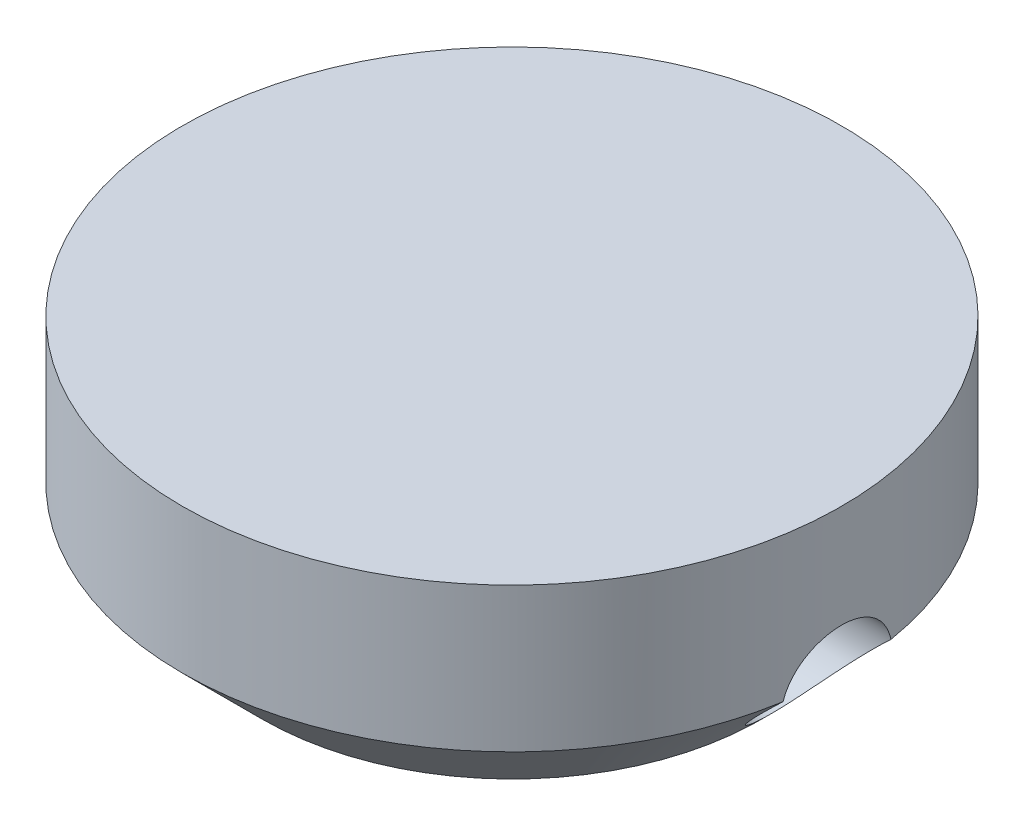
ISO-10303-21;
HEADER;
FILE_DESCRIPTION(('STEP AP214'),'2;1');
FILE_NAME('part.step','',(''),(''),'','','');
FILE_SCHEMA(('AUTOMOTIVE_DESIGN { 1 0 10303 214 1 1 1 1 }'));
ENDSEC;
DATA;
#1=APPLICATION_CONTEXT('core data for automotive mechanical design processes');
#2=APPLICATION_PROTOCOL_DEFINITION('international standard','automotive_design',2000,#1);
#3=PRODUCT_CONTEXT('',#1,'mechanical');
#4=PRODUCT('Part','Part','',(#3));
#5=PRODUCT_RELATED_PRODUCT_CATEGORY('part','',(#4));
#6=PRODUCT_DEFINITION_FORMATION('','',#4);
#7=PRODUCT_DEFINITION_CONTEXT('part definition',#1,'design');
#8=PRODUCT_DEFINITION('design','',#6,#7);
#9=PRODUCT_DEFINITION_SHAPE('','',#8);
#10=(LENGTH_UNIT() NAMED_UNIT(*) SI_UNIT(.MILLI.,.METRE.));
#11=(NAMED_UNIT(*) PLANE_ANGLE_UNIT() SI_UNIT($,.RADIAN.));
#12=(NAMED_UNIT(*) SI_UNIT($,.STERADIAN.) SOLID_ANGLE_UNIT());
#13=UNCERTAINTY_MEASURE_WITH_UNIT(LENGTH_MEASURE(1.E-05),#10,'distance_accuracy_value','');
#14=(GEOMETRIC_REPRESENTATION_CONTEXT(3) GLOBAL_UNCERTAINTY_ASSIGNED_CONTEXT((#13)) GLOBAL_UNIT_ASSIGNED_CONTEXT((#10,
#11,#12)) REPRESENTATION_CONTEXT('',''));
#15=CARTESIAN_POINT('',(0.,0.,0.));
#16=DIRECTION('',(0.,0.,1.));
#17=DIRECTION('',(1.,0.,0.));
#18=AXIS2_PLACEMENT_3D('',#15,#16,#17);
#19=CARTESIAN_POINT('',(0.,2.05188991842177,0.));
#20=DIRECTION('',(0.,1.,0.));
#21=DIRECTION('',(0.,0.,1.));
#22=AXIS2_PLACEMENT_3D('',#19,#20,#21);
#23=CYLINDRICAL_SURFACE('',#22,11.5);
#24=CARTESIAN_POINT('',(0.,3.36320645562729,0.));
#25=DIRECTION('',(0.,1.,0.));
#26=DIRECTION('',(0.,0.,1.));
#27=AXIS2_PLACEMENT_3D('',#24,#25,#26);
#28=CIRCLE('',#27,11.5);
#29=CARTESIAN_POINT('',(0.,3.36320645562729,11.5));
#30=VERTEX_POINT('',#29);
#31=EDGE_CURVE('E75',#30,#30,#28,.T.);
#32=ORIENTED_EDGE('',*,*,#31,.F.);
#33=EDGE_LOOP('',(#32));
#34=FACE_BOUND('',#33,.T.);
#35=CARTESIAN_POINT('',(0.,-1.67679354437271,0.));
#36=DIRECTION('',(0.,1.,0.));
#37=DIRECTION('',(0.,0.,1.));
#38=AXIS2_PLACEMENT_3D('',#35,#36,#37);
#39=CIRCLE('',#38,11.5);
#40=CARTESIAN_POINT('',(11.3444920556189,-1.67679354437274,-1.88480768249708));
#41=VERTEX_POINT('',#40);
#42=CARTESIAN_POINT('',(11.3444920556189,-1.67679354437271,1.88480768249708));
#43=VERTEX_POINT('',#42);
#44=EDGE_CURVE('E69',#41,#43,#39,.T.);
#45=ORIENTED_EDGE('',*,*,#44,.T.);
#46=CARTESIAN_POINT('',(11.3444920556189,-1.67679354437271,1.88480768249708));
#47=CARTESIAN_POINT('',(11.3468284221465,-1.62373960870673,1.87073340398523));
#48=CARTESIAN_POINT('',(11.3495124692565,-1.5713212912191,1.85442897940498));
#49=CARTESIAN_POINT('',(11.3554888369818,-1.46807999935229,1.81748001827356));
#50=CARTESIAN_POINT('',(11.3587810842125,-1.41725683336869,1.79683600529039));
#51=CARTESIAN_POINT('',(11.369427200217,-1.26783393344676,1.72865414954118));
#52=CARTESIAN_POINT('',(11.3775598493998,-1.17207968003871,1.67481284980909));
#53=CARTESIAN_POINT('',(11.394969652247,-0.991050854982532,1.55193475293948));
#54=CARTESIAN_POINT('',(11.4042469771064,-0.905777854702248,1.48289568164511));
#55=CARTESIAN_POINT('',(11.4229088745443,-0.747986225952632,1.33152357028815));
#56=CARTESIAN_POINT('',(11.4322934421887,-0.675467013170763,1.24919113959015));
#57=CARTESIAN_POINT('',(11.4501818370098,-0.544803105118978,1.07294693077831));
#58=CARTESIAN_POINT('',(11.4586799953876,-0.486747981292273,0.978968145029035));
#59=CARTESIAN_POINT('',(11.4737744859062,-0.387260320069406,0.782432281382731));
#60=CARTESIAN_POINT('',(11.4803706968045,-0.34582884230617,0.679874657152389));
#61=CARTESIAN_POINT('',(11.490876220563,-0.281072736992318,0.469827774989286));
#62=CARTESIAN_POINT('',(11.4948035571704,-0.257626507892004,0.362376935402624));
#63=CARTESIAN_POINT('',(11.4995992722202,-0.229106371226727,0.145007063385061));
#64=CARTESIAN_POINT('',(11.5004680921127,-0.22402981227744,0.0350883894533713));
#65=CARTESIAN_POINT('',(11.4990582011378,-0.232351895186461,-0.182709130590948));
#66=CARTESIAN_POINT('',(11.496816852495,-0.245531227049841,-0.290596679598678));
#67=CARTESIAN_POINT('',(11.489501556092,-0.289570038848792,-0.502603182224953));
#68=CARTESIAN_POINT('',(11.4844274548377,-0.320430476847251,-0.606721931303426));
#69=CARTESIAN_POINT('',(11.4719962073517,-0.398959680229114,-0.808415053102451));
#70=CARTESIAN_POINT('',(11.4646361588581,-0.446649823323022,-0.905980913600194));
#71=CARTESIAN_POINT('',(11.448437806743,-0.557465881502749,-1.09177819311709));
#72=CARTESIAN_POINT('',(11.4395994067786,-0.62059280271439,-1.18000900316665));
#73=CARTESIAN_POINT('',(11.4212881723889,-0.761432176749906,-1.34582166303546));
#74=CARTESIAN_POINT('',(11.4118087076437,-0.839319638095297,-1.42325408597318));
#75=CARTESIAN_POINT('',(11.3933744643323,-1.00700210476513,-1.56398887178821));
#76=CARTESIAN_POINT('',(11.3844195403974,-1.0967937882849,-1.62729516330683));
#77=CARTESIAN_POINT('',(11.3696678934275,-1.26710675148761,-1.72704748125247));
#78=CARTESIAN_POINT('',(11.3635966798849,-1.34595953597433,-1.76632885310879));
#79=CARTESIAN_POINT('',(11.3528749560394,-1.50826653134983,-1.83393731716198));
#80=CARTESIAN_POINT('',(11.3482236691574,-1.59171819745149,-1.86227039940366));
#81=CARTESIAN_POINT('',(11.3444920556189,-1.67679354437271,-1.88480768249708));
#82=B_SPLINE_CURVE_WITH_KNOTS('',3,(#46,#47,#48,#49,#50,#51,#52,#53,#54,#55,#56,#57,#58,#59,#60,
#61,#62,#63,#64,#65,#66,#67,#68,#69,#70,#71,#72,#73,#74,#75,#76,#77,#78,#79,#80,#81),
.UNSPECIFIED.,.F.,.F.,(4,2,2,2,2,2,2,2,2,2,2,2,2,2,2,2,2,4),(0.,0.164711990254142,
0.329404119527412,0.658171335010925,0.986987779887434,1.3157891561695,1.64657872933448,
1.9773893845087,2.30594315839199,2.63444950861043,2.95904351906084,3.28365511952444,
3.60868054662476,3.93372716361809,4.26290072119643,4.59198261736534,4.85610900275319,
5.12009067360874),.UNSPECIFIED.);
#83=EDGE_CURVE('E64',#43,#41,#82,.T.);
#84=ORIENTED_EDGE('',*,*,#83,.T.);
#85=EDGE_LOOP('',(#45,#84));
#86=FACE_BOUND('',#85,.T.);
#87=ADVANCED_FACE('F45',(#34,#86),#23,.T.);
#88=CARTESIAN_POINT('',(0.,-10.7267935443729,0.));
#89=DIRECTION('',(0.,1.,0.));
#90=DIRECTION('',(0.,0.,1.));
#91=AXIS2_PLACEMENT_3D('',#88,#89,#90);
#92=CONICAL_SURFACE('',#91,2.45,0.785398163397443);
#93=CARTESIAN_POINT('',(0.,-4.47679354437271,0.));
#94=DIRECTION('',(0.,-1.,0.));
#95=DIRECTION('',(0.,0.,-1.));
#96=AXIS2_PLACEMENT_3D('',#93,#94,#95);
#97=CIRCLE('',#96,8.70000000000009);
#98=CARTESIAN_POINT('',(0.,-4.47679354437271,-8.70000000000009));
#99=VERTEX_POINT('',#98);
#100=EDGE_CURVE('E59',#99,#99,#97,.T.);
#101=ORIENTED_EDGE('',*,*,#100,.F.);
#102=EDGE_LOOP('',(#101));
#103=FACE_BOUND('',#102,.T.);
#104=CARTESIAN_POINT('',(11.6061426012264,-1.43159354437271,1.80199249720969));
#105=CARTESIAN_POINT('',(11.5279158580471,-1.50428039621524,1.8320128172309));
#106=CARTESIAN_POINT('',(11.4490291959652,-1.57811809212512,1.85743787112628));
#107=CARTESIAN_POINT('',(11.2905611477516,-1.7276690109097,1.89917166663108));
#108=CARTESIAN_POINT('',(11.2109795054486,-1.80338294605263,1.91547688899015));
#109=CARTESIAN_POINT('',(11.0511880556809,-1.9567985849643,1.9391138869357));
#110=CARTESIAN_POINT('',(10.970978183577,-2.03451117806162,1.94637477854676));
#111=CARTESIAN_POINT('',(10.8112214228991,-2.19086357297871,1.95151716412626));
#112=CARTESIAN_POINT('',(10.7316743872075,-2.26950315916003,1.94940079811972));
#113=CARTESIAN_POINT('',(10.5237519186281,-2.47734971634499,1.93104833698264));
#114=CARTESIAN_POINT('',(10.3964089306532,-2.60699236136925,1.90670767190043));
#115=CARTESIAN_POINT('',(10.1488978086018,-2.86429666922943,1.82970004591626));
#116=CARTESIAN_POINT('',(10.0287093626456,-2.99196309571867,1.77711798726156));
#117=CARTESIAN_POINT('',(9.83117172657375,-3.2066753960387,1.65905664886782));
#118=CARTESIAN_POINT('',(9.75109038678959,-3.29528888329795,1.60102712819693));
#119=CARTESIAN_POINT('',(9.59945154066565,-3.46604957709664,1.4669907057576));
#120=CARTESIAN_POINT('',(9.52788270771035,-3.54820532567329,1.39100810366592));
#121=CARTESIAN_POINT('',(9.40935830809989,-3.68659566943572,1.23751432450478));
#122=CARTESIAN_POINT('',(9.36033999876943,-3.7447332021852,1.16332530723045));
#123=CARTESIAN_POINT('',(9.2713941062793,-3.85155036787317,1.00345099407743));
#124=CARTESIAN_POINT('',(9.23146387436412,-3.90023275594216,0.917769059455037));
#125=CARTESIAN_POINT('',(9.16218485644873,-3.98554628236984,0.735597372445281));
#126=CARTESIAN_POINT('',(9.13292596267207,-4.02207482451564,0.639024389645204));
#127=CARTESIAN_POINT('',(9.08705493499309,-4.07969511959211,0.438530872937108));
#128=CARTESIAN_POINT('',(9.07043141843112,-4.10080076567305,0.334617044547301));
#129=CARTESIAN_POINT('',(9.05214915662021,-4.12404404823324,0.138221249281872));
#130=CARTESIAN_POINT('',(9.04873022338802,-4.12841206152733,0.046160114219645));
#131=CARTESIAN_POINT('',(9.05210816850929,-4.1241064284966,-0.137450509603872));
#132=CARTESIAN_POINT('',(9.05890132744912,-4.11543753043103,-0.229000172463763));
#133=CARTESIAN_POINT('',(9.08170875918852,-4.08651558441075,-0.403538208434048));
#134=CARTESIAN_POINT('',(9.09717206636639,-4.06695513788901,-0.486716502932497));
#135=CARTESIAN_POINT('',(9.13628573487328,-4.01789810702338,-0.648031430616375));
#136=CARTESIAN_POINT('',(9.15993656258656,-3.98840095665936,-0.726167776297294));
#137=CARTESIAN_POINT('',(9.21616819395382,-3.91900491251078,-0.880192841740748));
#138=CARTESIAN_POINT('',(9.24918320247788,-3.87860665486834,-0.955695922385864));
#139=CARTESIAN_POINT('',(9.32231184164452,-3.79024139528291,-1.09833542456922));
#140=CARTESIAN_POINT('',(9.36242956518588,-3.74227003111666,-1.16546698384659));
#141=CARTESIAN_POINT('',(9.4672150403547,-3.61863006303115,-1.31793214914329));
#142=CARTESIAN_POINT('',(9.53501755507991,-3.53992697536068,-1.3986642066298));
#143=CARTESIAN_POINT('',(9.67982141013002,-3.37505724533394,-1.5422956593836));
#144=CARTESIAN_POINT('',(9.75684116492089,-3.28887576007166,-1.60515848043064));
#145=CARTESIAN_POINT('',(9.94539006218343,-3.08170043460063,-1.73296193245325));
#146=CARTESIAN_POINT('',(10.0596338993965,-2.95898550228085,-1.79108465979574));
#147=CARTESIAN_POINT('',(10.2956046481597,-2.71096237577228,-1.88004519073733));
#148=CARTESIAN_POINT('',(10.4173424639715,-2.58565058753249,-1.91084217957078));
#149=CARTESIAN_POINT('',(10.6681707495931,-2.3322075046328,-1.94812262070165));
#150=CARTESIAN_POINT('',(10.7973706812645,-2.20408995635013,-1.9539370053227));
#151=CARTESIAN_POINT('',(11.0570074781364,-1.95075066789551,-1.94099558597683));
#152=CARTESIAN_POINT('',(11.1874420224536,-1.82552460580043,-1.92227924354416));
#153=CARTESIAN_POINT('',(11.3656075845667,-1.65676817384387,-1.87997629337789));
#154=CARTESIAN_POINT('',(11.4140016280802,-1.61116493070446,-1.86677127655442));
#155=CARTESIAN_POINT('',(11.5103910299412,-1.52076558673305,-1.83695053168046));
#156=CARTESIAN_POINT('',(11.5583867519944,-1.47596869241121,-1.82033838140303));
#157=CARTESIAN_POINT('',(11.6061426012264,-1.43159354437271,-1.80199249720969));
#158=B_SPLINE_CURVE_WITH_KNOTS('',3,(#104,#105,#106,#107,#108,#109,#110,#111,#112,#113,#114,
#115,#116,#117,#118,#119,#120,#121,#122,#123,#124,#125,#126,#127,#128,#129,#130,#131,#132,#133,
#134,#135,#136,#137,#138,#139,#140,#141,#142,#143,#144,#145,#146,#147,#148,#149,#150,#151,#152,
#153,#154,#155,#156,#157),.UNSPECIFIED.,.F.,.F.,(4,2,2,2,2,2,2,2,2,2,2,2,2,2,2,2,2,2,2,2,2,2,2,
2,2,2,4),(0.,0.332630650640897,0.665389571669356,1.00074037302199,1.33601464644229,
1.88395095905799,2.43024915350797,2.82727760681341,3.22377172575004,3.54125143863902,
3.85863850200044,4.17864055074794,4.49835398083596,4.77358805101277,5.04872190065281,
5.30808254976316,5.56745797521983,5.84170269340373,6.116105960963,6.50861225722832,
6.90191623232042,7.43140911494124,7.9616915434317,8.50609045459935,9.04961468841831,
9.2529250263697,9.45602295471078),.UNSPECIFIED.);
#159=EDGE_CURVE('E11',#43,#41,#158,.T.);
#160=ORIENTED_EDGE('',*,*,#159,.F.);
#161=ORIENTED_EDGE('',*,*,#44,.F.);
#162=EDGE_LOOP('',(#160,#161));
#163=FACE_BOUND('',#162,.T.);
#164=ADVANCED_FACE('F47',(#103,#163),#92,.T.);
#165=CARTESIAN_POINT('',(0.,3.36320645562729,0.));
#166=DIRECTION('',(0.,1.,0.));
#167=DIRECTION('',(0.,0.,1.));
#168=AXIS2_PLACEMENT_3D('',#165,#166,#167);
#169=PLANE('',#168);
#170=ORIENTED_EDGE('',*,*,#31,.T.);
#171=EDGE_LOOP('',(#170));
#172=FACE_BOUND('',#171,.T.);
#173=ADVANCED_FACE('F103',(#172),#169,.T.);
#174=CARTESIAN_POINT('',(0.,-4.47679354437271,0.));
#175=DIRECTION('',(0.,-1.,0.));
#176=DIRECTION('',(0.,0.,-1.));
#177=AXIS2_PLACEMENT_3D('',#174,#175,#176);
#178=PLANE('',#177);
#179=ORIENTED_EDGE('',*,*,#100,.T.);
#180=EDGE_LOOP('',(#179));
#181=FACE_BOUND('',#180,.T.);
#182=ADVANCED_FACE('F100',(#181),#178,.T.);
#183=CARTESIAN_POINT('',(0.,5.42320645562729,0.));
#184=DIRECTION('',(0.,-1.,0.));
#185=DIRECTION('',(0.,0.,-1.));
#186=AXIS2_PLACEMENT_3D('',#183,#184,#185);
#187=CYLINDRICAL_SURFACE('',#186,1.95);
#188=CARTESIAN_POINT('',(0.,0.323206455627278,0.));
#189=DIRECTION('',(0.,1.,0.));
#190=DIRECTION('',(0.,0.,1.));
#191=AXIS2_PLACEMENT_3D('',#188,#189,#190);
#192=CIRCLE('',#191,1.95);
#193=CARTESIAN_POINT('',(-1.95,0.323206455627267,0.));
#194=VERTEX_POINT('',#193);
#195=EDGE_CURVE('E230',#194,#194,#192,.T.);
#196=ORIENTED_EDGE('',*,*,#195,.F.);
#197=EDGE_LOOP('',(#196));
#198=FACE_BOUND('',#197,.T.);
#199=CARTESIAN_POINT('',(0.,0.423206455627292,0.));
#200=DIRECTION('',(0.,1.,0.));
#201=DIRECTION('',(0.,0.,1.));
#202=AXIS2_PLACEMENT_3D('',#199,#200,#201);
#203=CIRCLE('',#202,1.95);
#204=CARTESIAN_POINT('',(0.,0.423206455627292,1.95));
#205=VERTEX_POINT('',#204);
#206=EDGE_CURVE('E70',#205,#205,#203,.T.);
#207=ORIENTED_EDGE('',*,*,#206,.T.);
#208=EDGE_LOOP('',(#207));
#209=FACE_BOUND('',#208,.T.);
#210=ADVANCED_FACE('F148',(#198,#209),#187,.F.);
#211=CARTESIAN_POINT('',(2.5,0.323206455627292,0.));
#212=DIRECTION('',(0.,0.,1.));
#213=DIRECTION('',(1.,0.,0.));
#214=AXIS2_PLACEMENT_3D('',#211,#212,#213);
#215=TOROIDAL_SURFACE('',#214,2.5,1.95);
#216=CARTESIAN_POINT('',(2.50000000000001,-2.17679354437271,0.));
#217=DIRECTION('',(-1.,0.,0.));
#218=DIRECTION('',(0.,0.,1.));
#219=AXIS2_PLACEMENT_3D('',#216,#217,#218);
#220=CIRCLE('',#219,1.95);
#221=CARTESIAN_POINT('',(2.50000000000002,-4.12679354437271,0.));
#222=VERTEX_POINT('',#221);
#223=EDGE_CURVE('E227',#222,#222,#220,.T.);
#224=CARTESIAN_POINT('',(2.5,0.323206455627292,0.));
#225=DIRECTION('',(0.,0.,1.));
#226=DIRECTION('',(1.,0.,0.));
#227=AXIS2_PLACEMENT_3D('',#224,#225,#226);
#228=CIRCLE('',#227,4.45);
#229=EDGE_CURVE('',#194,#222,#228,.T.);
#230=ORIENTED_EDGE('',*,*,#195,.T.);
#231=ORIENTED_EDGE('',*,*,#223,.F.);
#232=ORIENTED_EDGE('',*,*,#229,.T.);
#233=ORIENTED_EDGE('',*,*,#229,.F.);
#234=EDGE_LOOP('',(#230,#232,#231,#233));
#235=FACE_BOUND('',#234,.T.);
#236=ADVANCED_FACE('F144',(#235),#215,.F.);
#237=CARTESIAN_POINT('',(2.50000000000001,-2.17679354437271,0.));
#238=DIRECTION('',(1.,0.,0.));
#239=DIRECTION('',(0.,0.,-1.));
#240=AXIS2_PLACEMENT_3D('',#237,#238,#239);
#241=CYLINDRICAL_SURFACE('',#240,1.95);
#242=ORIENTED_EDGE('',*,*,#159,.T.);
#243=ORIENTED_EDGE('',*,*,#83,.F.);
#244=EDGE_LOOP('',(#242,#243));
#245=FACE_BOUND('',#244,.T.);
#246=ORIENTED_EDGE('',*,*,#223,.T.);
#247=EDGE_LOOP('',(#246));
#248=FACE_BOUND('',#247,.T.);
#249=ADVANCED_FACE('F72',(#245,#248),#241,.F.);
#250=CARTESIAN_POINT('',(0.,0.423206455627292,0.));
#251=DIRECTION('',(0.,1.,0.));
#252=DIRECTION('',(0.,0.,1.));
#253=AXIS2_PLACEMENT_3D('',#250,#251,#252);
#254=PLANE('',#253);
#255=ORIENTED_EDGE('',*,*,#206,.F.);
#256=EDGE_LOOP('',(#255));
#257=FACE_BOUND('',#256,.T.);
#258=CARTESIAN_POINT('',(0.,0.423206455627292,0.));
#259=DIRECTION('',(0.,1.,0.));
#260=DIRECTION('',(0.,0.,1.));
#261=AXIS2_PLACEMENT_3D('',#258,#259,#260);
#262=CIRCLE('',#261,8.7);
#263=CARTESIAN_POINT('',(0.,0.423206455627292,8.7));
#264=VERTEX_POINT('',#263);
#265=EDGE_CURVE('E78',#264,#264,#262,.T.);
#266=ORIENTED_EDGE('',*,*,#265,.T.);
#267=EDGE_LOOP('',(#266));
#268=FACE_BOUND('',#267,.T.);
#269=ADVANCED_FACE('F118',(#257,#268),#254,.T.);
#270=CARTESIAN_POINT('',(0.,2.05188991842177,0.));
#271=DIRECTION('',(0.,1.,0.));
#272=DIRECTION('',(0.,0.,1.));
#273=AXIS2_PLACEMENT_3D('',#270,#271,#272);
#274=CYLINDRICAL_SURFACE('',#273,9.5);
#275=CARTESIAN_POINT('',(0.,2.16320645562729,0.));
#276=DIRECTION('',(0.,-1.,0.));
#277=DIRECTION('',(0.,0.,-1.));
#278=AXIS2_PLACEMENT_3D('',#275,#276,#277);
#279=CIRCLE('',#278,9.5);
#280=CARTESIAN_POINT('',(0.,2.16320645562729,-9.5));
#281=VERTEX_POINT('',#280);
#282=EDGE_CURVE('E92',#281,#281,#279,.F.);
#283=ORIENTED_EDGE('',*,*,#282,.T.);
#284=EDGE_LOOP('',(#283));
#285=FACE_BOUND('',#284,.T.);
#286=CARTESIAN_POINT('',(0.,1.22320645562729,0.));
#287=DIRECTION('',(0.,1.,0.));
#288=DIRECTION('',(0.,0.,1.));
#289=AXIS2_PLACEMENT_3D('',#286,#287,#288);
#290=CIRCLE('',#289,9.5);
#291=CARTESIAN_POINT('',(0.,1.22320645562729,9.5));
#292=VERTEX_POINT('',#291);
#293=EDGE_CURVE('E89',#292,#292,#290,.F.);
#294=ORIENTED_EDGE('',*,*,#293,.T.);
#295=EDGE_LOOP('',(#294));
#296=FACE_BOUND('',#295,.T.);
#297=ADVANCED_FACE('F135',(#285,#296),#274,.F.);
#298=CARTESIAN_POINT('',(-9.5,3.16320645562729,0.));
#299=DIRECTION('',(0.,-1.,0.));
#300=DIRECTION('',(0.,0.,-1.));
#301=AXIS2_PLACEMENT_3D('',#298,#299,#300);
#302=PLANE('',#301);
#303=CARTESIAN_POINT('',(0.,3.16320645562729,0.));
#304=DIRECTION('',(0.,-1.,0.));
#305=DIRECTION('',(0.,0.,-1.));
#306=AXIS2_PLACEMENT_3D('',#303,#304,#305);
#307=CIRCLE('',#306,8.5);
#308=CARTESIAN_POINT('',(0.,3.16320645562729,-8.5));
#309=VERTEX_POINT('',#308);
#310=EDGE_CURVE('E95',#309,#309,#307,.T.);
#311=ORIENTED_EDGE('',*,*,#310,.T.);
#312=EDGE_LOOP('',(#311));
#313=FACE_BOUND('',#312,.T.);
#314=ADVANCED_FACE('F124',(#313),#302,.T.);
#315=CARTESIAN_POINT('',(0.,1.22320645562729,0.));
#316=DIRECTION('',(0.,1.,0.));
#317=DIRECTION('',(0.,0.,1.));
#318=AXIS2_PLACEMENT_3D('',#315,#316,#317);
#319=TOROIDAL_SURFACE('',#318,8.7,0.8);
#320=ORIENTED_EDGE('',*,*,#293,.F.);
#321=EDGE_LOOP('',(#320));
#322=FACE_BOUND('',#321,.T.);
#323=ORIENTED_EDGE('',*,*,#265,.F.);
#324=EDGE_LOOP('',(#323));
#325=FACE_BOUND('',#324,.T.);
#326=ADVANCED_FACE('F121',(#322,#325),#319,.F.);
#327=CARTESIAN_POINT('',(0.,2.16320645562729,0.));
#328=DIRECTION('',(0.,-1.,0.));
#329=DIRECTION('',(0.,0.,-1.));
#330=AXIS2_PLACEMENT_3D('',#327,#328,#329);
#331=TOROIDAL_SURFACE('',#330,8.5,1.);
#332=ORIENTED_EDGE('',*,*,#310,.F.);
#333=EDGE_LOOP('',(#332));
#334=FACE_BOUND('',#333,.T.);
#335=ORIENTED_EDGE('',*,*,#282,.F.);
#336=EDGE_LOOP('',(#335));
#337=FACE_BOUND('',#336,.T.);
#338=ADVANCED_FACE('F123',(#334,#337),#331,.F.);
#339=CLOSED_SHELL('',(#87,#164,#173,#182,#210,#236,#249,#269,#297,#314,#326,#338));
#340=MANIFOLD_SOLID_BREP('B2',#339);
#341=ADVANCED_BREP_SHAPE_REPRESENTATION('',(#18,#340),#14);
#342=SHAPE_DEFINITION_REPRESENTATION(#9,#341);
ENDSEC;
END-ISO-10303-21;
